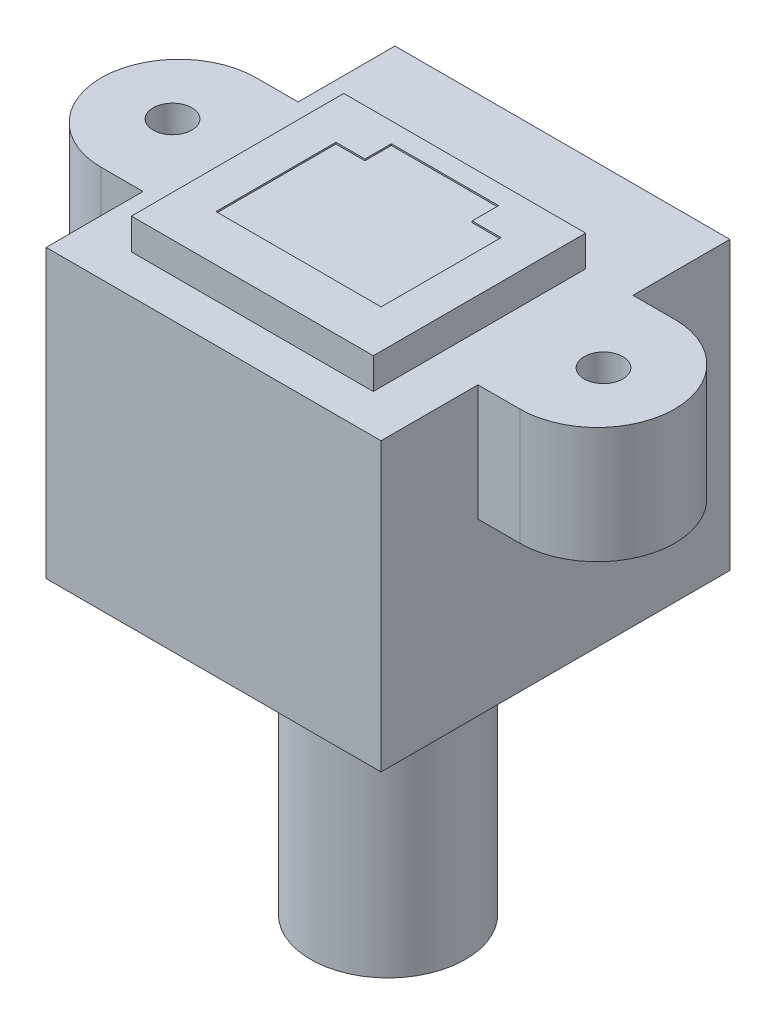
ISO-10303-21;
HEADER;
FILE_DESCRIPTION(('STEP AP214'),'2;1');
FILE_NAME('part.step','',(''),(''),'','','');
FILE_SCHEMA(('AUTOMOTIVE_DESIGN { 1 0 10303 214 1 1 1 1 }'));
ENDSEC;
DATA;
#1=APPLICATION_CONTEXT('core data for automotive mechanical design processes');
#2=APPLICATION_PROTOCOL_DEFINITION('international standard','automotive_design',2000,#1);
#3=PRODUCT_CONTEXT('',#1,'mechanical');
#4=PRODUCT('Part','Part','',(#3));
#5=PRODUCT_RELATED_PRODUCT_CATEGORY('part','',(#4));
#6=PRODUCT_DEFINITION_FORMATION('','',#4);
#7=PRODUCT_DEFINITION_CONTEXT('part definition',#1,'design');
#8=PRODUCT_DEFINITION('design','',#6,#7);
#9=PRODUCT_DEFINITION_SHAPE('','',#8);
#10=(LENGTH_UNIT() NAMED_UNIT(*) SI_UNIT(.MILLI.,.METRE.));
#11=(NAMED_UNIT(*) PLANE_ANGLE_UNIT() SI_UNIT($,.RADIAN.));
#12=(NAMED_UNIT(*) SI_UNIT($,.STERADIAN.) SOLID_ANGLE_UNIT());
#13=UNCERTAINTY_MEASURE_WITH_UNIT(LENGTH_MEASURE(1.E-05),#10,'distance_accuracy_value','');
#14=(GEOMETRIC_REPRESENTATION_CONTEXT(3) GLOBAL_UNCERTAINTY_ASSIGNED_CONTEXT((#13)) GLOBAL_UNIT_ASSIGNED_CONTEXT((#10,
#11,#12)) REPRESENTATION_CONTEXT('',''));
#15=CARTESIAN_POINT('',(0.,0.,0.));
#16=DIRECTION('',(0.,0.,1.));
#17=DIRECTION('',(1.,0.,0.));
#18=AXIS2_PLACEMENT_3D('',#15,#16,#17);
#19=CARTESIAN_POINT('',(-13.5,0.,-1.9));
#20=DIRECTION('',(0.,-1.,0.));
#21=DIRECTION('',(0.,0.,-1.));
#22=AXIS2_PLACEMENT_3D('',#19,#20,#21);
#23=PLANE('',#22);
#24=DIRECTION('',(0.,0.,-1.));
#25=VECTOR('',#24,1.);
#26=CARTESIAN_POINT('',(-10.8,0.,9.35));
#27=LINE('',#26,#25);
#28=CARTESIAN_POINT('',(-10.8,0.,9.35));
#29=VERTEX_POINT('',#28);
#30=CARTESIAN_POINT('',(-10.8,0.,3.1));
#31=VERTEX_POINT('',#30);
#32=EDGE_CURVE('E312',#29,#31,#27,.T.);
#33=ORIENTED_EDGE('',*,*,#32,.F.);
#34=DIRECTION('',(-1.,0.,0.));
#35=VECTOR('',#34,1.);
#36=CARTESIAN_POINT('',(-10.8,0.,9.35));
#37=LINE('',#36,#35);
#38=CARTESIAN_POINT('',(10.8,0.,9.35));
#39=VERTEX_POINT('',#38);
#40=EDGE_CURVE('E301',#39,#29,#37,.T.);
#41=ORIENTED_EDGE('',*,*,#40,.F.);
#42=DIRECTION('',(0.,0.,1.));
#43=VECTOR('',#42,1.);
#44=CARTESIAN_POINT('',(10.8,0.,9.35));
#45=LINE('',#44,#43);
#46=CARTESIAN_POINT('',(10.8,0.,3.1));
#47=VERTEX_POINT('',#46);
#48=EDGE_CURVE('E335',#47,#39,#45,.T.);
#49=ORIENTED_EDGE('',*,*,#48,.F.);
#50=DIRECTION('',(-1.,0.,0.));
#51=VECTOR('',#50,1.);
#52=CARTESIAN_POINT('',(13.5,0.,3.1));
#53=LINE('',#52,#51);
#54=CARTESIAN_POINT('',(13.5,0.,3.1));
#55=VERTEX_POINT('',#54);
#56=EDGE_CURVE('E333',#55,#47,#53,.T.);
#57=ORIENTED_EDGE('',*,*,#56,.F.);
#58=CARTESIAN_POINT('',(13.5,0.,-1.9));
#59=DIRECTION('',(0.,-1.,0.));
#60=DIRECTION('',(0.,0.,-1.));
#61=AXIS2_PLACEMENT_3D('',#58,#59,#60);
#62=CIRCLE('',#61,5.);
#63=CARTESIAN_POINT('',(13.5,0.,-6.9));
#64=VERTEX_POINT('',#63);
#65=EDGE_CURVE('E331',#64,#55,#62,.T.);
#66=ORIENTED_EDGE('',*,*,#65,.F.);
#67=DIRECTION('',(1.,0.,0.));
#68=VECTOR('',#67,1.);
#69=CARTESIAN_POINT('',(10.8,0.,-6.9));
#70=LINE('',#69,#68);
#71=CARTESIAN_POINT('',(10.8,0.,-6.9));
#72=VERTEX_POINT('',#71);
#73=EDGE_CURVE('E329',#72,#64,#70,.T.);
#74=ORIENTED_EDGE('',*,*,#73,.F.);
#75=DIRECTION('',(0.,0.,1.));
#76=VECTOR('',#75,1.);
#77=CARTESIAN_POINT('',(10.8,0.,-6.9));
#78=LINE('',#77,#76);
#79=CARTESIAN_POINT('',(10.8,0.,-13.15));
#80=VERTEX_POINT('',#79);
#81=EDGE_CURVE('E327',#80,#72,#78,.T.);
#82=ORIENTED_EDGE('',*,*,#81,.F.);
#83=DIRECTION('',(1.,0.,0.));
#84=VECTOR('',#83,1.);
#85=CARTESIAN_POINT('',(-10.8,0.,-13.15));
#86=LINE('',#85,#84);
#87=CARTESIAN_POINT('',(-10.8,0.,-13.15));
#88=VERTEX_POINT('',#87);
#89=EDGE_CURVE('E324',#88,#80,#86,.T.);
#90=ORIENTED_EDGE('',*,*,#89,.F.);
#91=DIRECTION('',(0.,0.,-1.));
#92=VECTOR('',#91,1.);
#93=CARTESIAN_POINT('',(-10.8,0.,-6.9));
#94=LINE('',#93,#92);
#95=CARTESIAN_POINT('',(-10.8,0.,-6.9));
#96=VERTEX_POINT('',#95);
#97=EDGE_CURVE('E321',#96,#88,#94,.T.);
#98=ORIENTED_EDGE('',*,*,#97,.F.);
#99=DIRECTION('',(1.,0.,0.));
#100=VECTOR('',#99,1.);
#101=CARTESIAN_POINT('',(-13.5,0.,-6.9));
#102=LINE('',#101,#100);
#103=CARTESIAN_POINT('',(-13.5,0.,-6.9));
#104=VERTEX_POINT('',#103);
#105=EDGE_CURVE('E319',#104,#96,#102,.T.);
#106=ORIENTED_EDGE('',*,*,#105,.F.);
#107=CARTESIAN_POINT('',(-13.5,0.,-1.9));
#108=DIRECTION('',(0.,-1.,0.));
#109=DIRECTION('',(0.,0.,-1.));
#110=AXIS2_PLACEMENT_3D('',#107,#108,#109);
#111=CIRCLE('',#110,5.);
#112=CARTESIAN_POINT('',(-13.5,0.,3.1));
#113=VERTEX_POINT('',#112);
#114=EDGE_CURVE('E317',#113,#104,#111,.T.);
#115=ORIENTED_EDGE('',*,*,#114,.F.);
#116=DIRECTION('',(-1.,0.,0.));
#117=VECTOR('',#116,1.);
#118=CARTESIAN_POINT('',(-13.5,0.,3.1));
#119=LINE('',#118,#117);
#120=EDGE_CURVE('E315',#31,#113,#119,.T.);
#121=ORIENTED_EDGE('',*,*,#120,.F.);
#122=EDGE_LOOP('',(#33,#41,#49,#57,#66,#74,#82,#90,#98,#106,#115,#121));
#123=FACE_BOUND('',#122,.T.);
#124=DIRECTION('',(1.,0.,0.));
#125=VECTOR('',#124,1.);
#126=CARTESIAN_POINT('',(7.8,0.,6.85));
#127=LINE('',#126,#125);
#128=CARTESIAN_POINT('',(-7.8,0.,6.85));
#129=VERTEX_POINT('',#128);
#130=CARTESIAN_POINT('',(7.8,0.,6.85));
#131=VERTEX_POINT('',#130);
#132=EDGE_CURVE('E385',#129,#131,#127,.T.);
#133=ORIENTED_EDGE('',*,*,#132,.F.);
#134=DIRECTION('',(0.,0.,1.));
#135=VECTOR('',#134,1.);
#136=CARTESIAN_POINT('',(-7.8,0.,6.85));
#137=LINE('',#136,#135);
#138=CARTESIAN_POINT('',(-7.8,0.,-6.85));
#139=VERTEX_POINT('',#138);
#140=EDGE_CURVE('E371',#139,#129,#137,.T.);
#141=ORIENTED_EDGE('',*,*,#140,.F.);
#142=DIRECTION('',(-1.,0.,0.));
#143=VECTOR('',#142,1.);
#144=CARTESIAN_POINT('',(7.8,0.,-6.85));
#145=LINE('',#144,#143);
#146=CARTESIAN_POINT('',(7.8,0.,-6.85));
#147=VERTEX_POINT('',#146);
#148=EDGE_CURVE('E376',#147,#139,#145,.T.);
#149=ORIENTED_EDGE('',*,*,#148,.F.);
#150=DIRECTION('',(0.,0.,-1.));
#151=VECTOR('',#150,1.);
#152=CARTESIAN_POINT('',(7.8,0.,6.85));
#153=LINE('',#152,#151);
#154=EDGE_CURVE('E388',#131,#147,#153,.T.);
#155=ORIENTED_EDGE('',*,*,#154,.F.);
#156=EDGE_LOOP('',(#133,#141,#149,#155));
#157=FACE_BOUND('',#156,.T.);
#158=CARTESIAN_POINT('',(-13.9,0.,-1.9));
#159=DIRECTION('',(0.,1.,0.));
#160=DIRECTION('',(0.,0.,1.));
#161=AXIS2_PLACEMENT_3D('',#158,#159,#160);
#162=CIRCLE('',#161,1.25);
#163=CARTESIAN_POINT('',(-13.9,0.,-0.650000000000003));
#164=VERTEX_POINT('',#163);
#165=EDGE_CURVE('E869',#164,#164,#162,.T.);
#166=ORIENTED_EDGE('',*,*,#165,.F.);
#167=EDGE_LOOP('',(#166));
#168=FACE_BOUND('',#167,.T.);
#169=CARTESIAN_POINT('',(13.9,0.,-1.9));
#170=DIRECTION('',(0.,1.,0.));
#171=DIRECTION('',(0.,0.,1.));
#172=AXIS2_PLACEMENT_3D('',#169,#170,#171);
#173=CIRCLE('',#172,1.25);
#174=CARTESIAN_POINT('',(13.9,0.,-0.650000000000003));
#175=VERTEX_POINT('',#174);
#176=EDGE_CURVE('E865',#175,#175,#173,.T.);
#177=ORIENTED_EDGE('',*,*,#176,.F.);
#178=EDGE_LOOP('',(#177));
#179=FACE_BOUND('',#178,.T.);
#180=ADVANCED_FACE('F36',(#123,#157,#168,#179),#23,.F.);
#181=CARTESIAN_POINT('',(-13.5,-7.5,-1.9));
#182=DIRECTION('',(0.,-1.,0.));
#183=DIRECTION('',(0.,0.,-1.));
#184=AXIS2_PLACEMENT_3D('',#181,#182,#183);
#185=PLANE('',#184);
#186=CARTESIAN_POINT('',(-13.9,-7.5,-1.9));
#187=DIRECTION('',(0.,-1.,0.));
#188=DIRECTION('',(0.,0.,-1.));
#189=AXIS2_PLACEMENT_3D('',#186,#187,#188);
#190=CIRCLE('',#189,1.25);
#191=CARTESIAN_POINT('',(-13.9,-7.5,-3.15));
#192=VERTEX_POINT('',#191);
#193=EDGE_CURVE('E237',#192,#192,#190,.T.);
#194=ORIENTED_EDGE('',*,*,#193,.F.);
#195=EDGE_LOOP('',(#194));
#196=FACE_BOUND('',#195,.T.);
#197=DIRECTION('',(0.,0.,-1.));
#198=VECTOR('',#197,1.);
#199=CARTESIAN_POINT('',(-10.8,-7.5,9.35));
#200=LINE('',#199,#198);
#201=CARTESIAN_POINT('',(-10.8,-7.5,3.1));
#202=VERTEX_POINT('',#201);
#203=CARTESIAN_POINT('',(-10.8,-7.5,-6.9));
#204=VERTEX_POINT('',#203);
#205=EDGE_CURVE('E290',#202,#204,#200,.T.);
#206=ORIENTED_EDGE('',*,*,#205,.F.);
#207=DIRECTION('',(-1.,0.,0.));
#208=VECTOR('',#207,1.);
#209=CARTESIAN_POINT('',(-13.5,-7.5,3.1));
#210=LINE('',#209,#208);
#211=CARTESIAN_POINT('',(-13.5,-7.5,3.1));
#212=VERTEX_POINT('',#211);
#213=EDGE_CURVE('E298',#202,#212,#210,.T.);
#214=ORIENTED_EDGE('',*,*,#213,.T.);
#215=CARTESIAN_POINT('',(-13.5,-7.5,-1.9));
#216=DIRECTION('',(0.,-1.,0.));
#217=DIRECTION('',(0.,0.,-1.));
#218=AXIS2_PLACEMENT_3D('',#215,#216,#217);
#219=CIRCLE('',#218,5.);
#220=CARTESIAN_POINT('',(-13.5,-7.5,-6.9));
#221=VERTEX_POINT('',#220);
#222=EDGE_CURVE('E300',#212,#221,#219,.T.);
#223=ORIENTED_EDGE('',*,*,#222,.T.);
#224=DIRECTION('',(1.,0.,0.));
#225=VECTOR('',#224,1.);
#226=CARTESIAN_POINT('',(-13.5,-7.5,-6.9));
#227=LINE('',#226,#225);
#228=EDGE_CURVE('E303',#221,#204,#227,.T.);
#229=ORIENTED_EDGE('',*,*,#228,.T.);
#230=EDGE_LOOP('',(#206,#214,#223,#229));
#231=FACE_BOUND('',#230,.T.);
#232=ADVANCED_FACE('F460',(#196,#231),#185,.T.);
#233=CARTESIAN_POINT('',(-7.8,2.,6.85));
#234=DIRECTION('',(1.,0.,0.));
#235=DIRECTION('',(0.,0.,-1.));
#236=AXIS2_PLACEMENT_3D('',#233,#234,#235);
#237=PLANE('',#236);
#238=ORIENTED_EDGE('',*,*,#140,.T.);
#239=DIRECTION('',(0.,-1.,0.));
#240=VECTOR('',#239,1.);
#241=CARTESIAN_POINT('',(-7.8,2.,6.85));
#242=LINE('',#241,#240);
#243=CARTESIAN_POINT('',(-7.8,2.,6.85));
#244=VERTEX_POINT('',#243);
#245=EDGE_CURVE('E297',#244,#129,#242,.T.);
#246=ORIENTED_EDGE('',*,*,#245,.F.);
#247=DIRECTION('',(0.,0.,1.));
#248=VECTOR('',#247,1.);
#249=CARTESIAN_POINT('',(-7.8,2.,6.85));
#250=LINE('',#249,#248);
#251=CARTESIAN_POINT('',(-7.8,2.,-6.85));
#252=VERTEX_POINT('',#251);
#253=EDGE_CURVE('E372',#252,#244,#250,.T.);
#254=ORIENTED_EDGE('',*,*,#253,.F.);
#255=DIRECTION('',(0.,-1.,0.));
#256=VECTOR('',#255,1.);
#257=CARTESIAN_POINT('',(-7.8,2.,-6.85));
#258=LINE('',#257,#256);
#259=EDGE_CURVE('E382',#252,#139,#258,.T.);
#260=ORIENTED_EDGE('',*,*,#259,.T.);
#261=EDGE_LOOP('',(#238,#246,#254,#260));
#262=FACE_BOUND('',#261,.T.);
#263=ADVANCED_FACE('F469',(#262),#237,.F.);
#264=CARTESIAN_POINT('',(7.8,2.,6.85));
#265=DIRECTION('',(0.,0.,-1.));
#266=DIRECTION('',(-1.,0.,0.));
#267=AXIS2_PLACEMENT_3D('',#264,#265,#266);
#268=PLANE('',#267);
#269=ORIENTED_EDGE('',*,*,#132,.T.);
#270=DIRECTION('',(0.,-1.,0.));
#271=VECTOR('',#270,1.);
#272=CARTESIAN_POINT('',(7.8,2.,6.85));
#273=LINE('',#272,#271);
#274=CARTESIAN_POINT('',(7.8,2.,6.85));
#275=VERTEX_POINT('',#274);
#276=EDGE_CURVE('E398',#275,#131,#273,.T.);
#277=ORIENTED_EDGE('',*,*,#276,.F.);
#278=DIRECTION('',(1.,0.,0.));
#279=VECTOR('',#278,1.);
#280=CARTESIAN_POINT('',(7.8,2.,6.85));
#281=LINE('',#280,#279);
#282=EDGE_CURVE('E375',#244,#275,#281,.T.);
#283=ORIENTED_EDGE('',*,*,#282,.F.);
#284=ORIENTED_EDGE('',*,*,#245,.T.);
#285=EDGE_LOOP('',(#269,#277,#283,#284));
#286=FACE_BOUND('',#285,.T.);
#287=ADVANCED_FACE('F519',(#286),#268,.F.);
#288=CARTESIAN_POINT('',(7.8,2.,6.85));
#289=DIRECTION('',(-1.,0.,0.));
#290=DIRECTION('',(0.,0.,1.));
#291=AXIS2_PLACEMENT_3D('',#288,#289,#290);
#292=PLANE('',#291);
#293=ORIENTED_EDGE('',*,*,#154,.T.);
#294=DIRECTION('',(0.,-1.,0.));
#295=VECTOR('',#294,1.);
#296=CARTESIAN_POINT('',(7.8,2.,-6.85));
#297=LINE('',#296,#295);
#298=CARTESIAN_POINT('',(7.8,2.,-6.85));
#299=VERTEX_POINT('',#298);
#300=EDGE_CURVE('E395',#299,#147,#297,.T.);
#301=ORIENTED_EDGE('',*,*,#300,.F.);
#302=DIRECTION('',(0.,0.,-1.));
#303=VECTOR('',#302,1.);
#304=CARTESIAN_POINT('',(7.8,2.,6.85));
#305=LINE('',#304,#303);
#306=EDGE_CURVE('E378',#275,#299,#305,.T.);
#307=ORIENTED_EDGE('',*,*,#306,.F.);
#308=ORIENTED_EDGE('',*,*,#276,.T.);
#309=EDGE_LOOP('',(#293,#301,#307,#308));
#310=FACE_BOUND('',#309,.T.);
#311=ADVANCED_FACE('F515',(#310),#292,.F.);
#312=CARTESIAN_POINT('',(7.8,2.,-6.85));
#313=DIRECTION('',(0.,0.,1.));
#314=DIRECTION('',(1.,0.,0.));
#315=AXIS2_PLACEMENT_3D('',#312,#313,#314);
#316=PLANE('',#315);
#317=ORIENTED_EDGE('',*,*,#148,.T.);
#318=ORIENTED_EDGE('',*,*,#259,.F.);
#319=DIRECTION('',(-1.,0.,0.));
#320=VECTOR('',#319,1.);
#321=CARTESIAN_POINT('',(7.8,2.,-6.85));
#322=LINE('',#321,#320);
#323=EDGE_CURVE('E380',#299,#252,#322,.T.);
#324=ORIENTED_EDGE('',*,*,#323,.F.);
#325=ORIENTED_EDGE('',*,*,#300,.T.);
#326=EDGE_LOOP('',(#317,#318,#324,#325));
#327=FACE_BOUND('',#326,.T.);
#328=ADVANCED_FACE('F511',(#327),#316,.F.);
#329=CARTESIAN_POINT('',(0.,2.,0.));
#330=DIRECTION('',(0.,1.,0.));
#331=DIRECTION('',(0.,0.,1.));
#332=AXIS2_PLACEMENT_3D('',#329,#330,#331);
#333=PLANE('',#332);
#334=DIRECTION('',(-1.,0.,0.));
#335=VECTOR('',#334,1.);
#336=CARTESIAN_POINT('',(-3.45868570875021,2.,-3.86958379540227));
#337=LINE('',#336,#335);
#338=CARTESIAN_POINT('',(-3.45868570875021,2.,-3.86958379540227));
#339=VERTEX_POINT('',#338);
#340=CARTESIAN_POINT('',(-5.32674456624502,2.,-3.86958379540227));
#341=VERTEX_POINT('',#340);
#342=EDGE_CURVE('E53',#339,#341,#337,.T.);
#343=ORIENTED_EDGE('',*,*,#342,.F.);
#344=DIRECTION('',(0.,0.,1.));
#345=VECTOR('',#344,1.);
#346=CARTESIAN_POINT('',(-3.45868570875021,2.,-3.86958379540227));
#347=LINE('',#346,#345);
#348=CARTESIAN_POINT('',(-3.45868570875021,2.,-5.57520275224535));
#349=VERTEX_POINT('',#348);
#350=EDGE_CURVE('E231',#349,#339,#347,.T.);
#351=ORIENTED_EDGE('',*,*,#350,.F.);
#352=DIRECTION('',(-1.,0.,0.));
#353=VECTOR('',#352,1.);
#354=CARTESIAN_POINT('',(-3.45868570875021,2.,-5.57520275224535));
#355=LINE('',#354,#353);
#356=CARTESIAN_POINT('',(3.45868570875021,2.,-5.57520275224535));
#357=VERTEX_POINT('',#356);
#358=EDGE_CURVE('E234',#357,#349,#355,.T.);
#359=ORIENTED_EDGE('',*,*,#358,.F.);
#360=DIRECTION('',(0.,0.,-1.));
#361=VECTOR('',#360,1.);
#362=CARTESIAN_POINT('',(3.45868570875021,2.,-3.86958379540227));
#363=LINE('',#362,#361);
#364=CARTESIAN_POINT('',(3.45868570875021,2.,-3.86958379540227));
#365=VERTEX_POINT('',#364);
#366=EDGE_CURVE('E265',#365,#357,#363,.T.);
#367=ORIENTED_EDGE('',*,*,#366,.F.);
#368=DIRECTION('',(-1.,0.,0.));
#369=VECTOR('',#368,1.);
#370=CARTESIAN_POINT('',(5.32674456624502,2.,-3.86958379540227));
#371=LINE('',#370,#369);
#372=CARTESIAN_POINT('',(5.32674456624502,2.,-3.86958379540227));
#373=VERTEX_POINT('',#372);
#374=EDGE_CURVE('E262',#373,#365,#371,.T.);
#375=ORIENTED_EDGE('',*,*,#374,.F.);
#376=DIRECTION('',(0.,0.,-1.));
#377=VECTOR('',#376,1.);
#378=CARTESIAN_POINT('',(5.32674456624502,2.,3.86958379540227));
#379=LINE('',#378,#377);
#380=CARTESIAN_POINT('',(5.32674456624502,2.,3.86958379540227));
#381=VERTEX_POINT('',#380);
#382=EDGE_CURVE('E259',#381,#373,#379,.T.);
#383=ORIENTED_EDGE('',*,*,#382,.F.);
#384=DIRECTION('',(1.,0.,0.));
#385=VECTOR('',#384,1.);
#386=CARTESIAN_POINT('',(5.32674456624502,2.,3.86958379540227));
#387=LINE('',#386,#385);
#388=CARTESIAN_POINT('',(-5.32674456624502,2.,3.86958379540227));
#389=VERTEX_POINT('',#388);
#390=EDGE_CURVE('E256',#389,#381,#387,.T.);
#391=ORIENTED_EDGE('',*,*,#390,.F.);
#392=DIRECTION('',(0.,0.,1.));
#393=VECTOR('',#392,1.);
#394=CARTESIAN_POINT('',(-5.32674456624502,2.,3.86958379540227));
#395=LINE('',#394,#393);
#396=EDGE_CURVE('E254',#341,#389,#395,.T.);
#397=ORIENTED_EDGE('',*,*,#396,.F.);
#398=EDGE_LOOP('',(#343,#351,#359,#367,#375,#383,#391,#397));
#399=FACE_BOUND('',#398,.T.);
#400=ORIENTED_EDGE('',*,*,#253,.T.);
#401=ORIENTED_EDGE('',*,*,#282,.T.);
#402=ORIENTED_EDGE('',*,*,#306,.T.);
#403=ORIENTED_EDGE('',*,*,#323,.T.);
#404=EDGE_LOOP('',(#400,#401,#402,#403));
#405=FACE_BOUND('',#404,.T.);
#406=ADVANCED_FACE('F508',(#399,#405),#333,.T.);
#407=CARTESIAN_POINT('',(-10.8,-7.5,9.35));
#408=DIRECTION('',(1.,0.,0.));
#409=DIRECTION('',(0.,0.,-1.));
#410=AXIS2_PLACEMENT_3D('',#407,#408,#409);
#411=PLANE('',#410);
#412=DIRECTION('',(0.,1.,0.));
#413=VECTOR('',#412,1.);
#414=CARTESIAN_POINT('',(-10.8,-7.5,-13.15));
#415=LINE('',#414,#413);
#416=CARTESIAN_POINT('',(-10.8,-18.5,-13.15));
#417=VERTEX_POINT('',#416);
#418=EDGE_CURVE('E357',#417,#88,#415,.T.);
#419=ORIENTED_EDGE('',*,*,#418,.F.);
#420=DIRECTION('',(0.,0.,1.));
#421=VECTOR('',#420,1.);
#422=CARTESIAN_POINT('',(-10.8,-18.5,9.35));
#423=LINE('',#422,#421);
#424=CARTESIAN_POINT('',(-10.8,-18.5,9.35));
#425=VERTEX_POINT('',#424);
#426=EDGE_CURVE('E11',#417,#425,#423,.T.);
#427=ORIENTED_EDGE('',*,*,#426,.T.);
#428=DIRECTION('',(0.,1.,0.));
#429=VECTOR('',#428,1.);
#430=CARTESIAN_POINT('',(-10.8,-7.5,9.35));
#431=LINE('',#430,#429);
#432=EDGE_CURVE('E311',#425,#29,#431,.T.);
#433=ORIENTED_EDGE('',*,*,#432,.T.);
#434=ORIENTED_EDGE('',*,*,#32,.T.);
#435=DIRECTION('',(0.,1.,0.));
#436=VECTOR('',#435,1.);
#437=CARTESIAN_POINT('',(-10.8,-7.5,3.1));
#438=LINE('',#437,#436);
#439=EDGE_CURVE('E368',#202,#31,#438,.T.);
#440=ORIENTED_EDGE('',*,*,#439,.F.);
#441=ORIENTED_EDGE('',*,*,#205,.T.);
#442=DIRECTION('',(0.,1.,0.));
#443=VECTOR('',#442,1.);
#444=CARTESIAN_POINT('',(-10.8,-7.5,-6.9));
#445=LINE('',#444,#443);
#446=EDGE_CURVE('E359',#204,#96,#445,.T.);
#447=ORIENTED_EDGE('',*,*,#446,.T.);
#448=ORIENTED_EDGE('',*,*,#97,.T.);
#449=EDGE_LOOP('',(#419,#427,#433,#434,#440,#441,#447,#448));
#450=FACE_BOUND('',#449,.T.);
#451=ADVANCED_FACE('F438',(#450),#411,.F.);
#452=CARTESIAN_POINT('',(-13.5,-7.5,3.1));
#453=DIRECTION('',(0.,0.,-1.));
#454=DIRECTION('',(-1.,0.,0.));
#455=AXIS2_PLACEMENT_3D('',#452,#453,#454);
#456=PLANE('',#455);
#457=ORIENTED_EDGE('',*,*,#120,.T.);
#458=DIRECTION('',(0.,1.,0.));
#459=VECTOR('',#458,1.);
#460=CARTESIAN_POINT('',(-13.5,-7.5,3.1));
#461=LINE('',#460,#459);
#462=EDGE_CURVE('E365',#212,#113,#461,.T.);
#463=ORIENTED_EDGE('',*,*,#462,.F.);
#464=ORIENTED_EDGE('',*,*,#213,.F.);
#465=ORIENTED_EDGE('',*,*,#439,.T.);
#466=EDGE_LOOP('',(#457,#463,#464,#465));
#467=FACE_BOUND('',#466,.T.);
#468=ADVANCED_FACE('F501',(#467),#456,.F.);
#469=CARTESIAN_POINT('',(-13.5,-7.5,-1.9));
#470=DIRECTION('',(0.,1.,0.));
#471=DIRECTION('',(0.,0.,1.));
#472=AXIS2_PLACEMENT_3D('',#469,#470,#471);
#473=CYLINDRICAL_SURFACE('',#472,5.);
#474=ORIENTED_EDGE('',*,*,#114,.T.);
#475=DIRECTION('',(0.,1.,0.));
#476=VECTOR('',#475,1.);
#477=CARTESIAN_POINT('',(-13.5,-7.5,-6.9));
#478=LINE('',#477,#476);
#479=EDGE_CURVE('E362',#221,#104,#478,.T.);
#480=ORIENTED_EDGE('',*,*,#479,.F.);
#481=ORIENTED_EDGE('',*,*,#222,.F.);
#482=ORIENTED_EDGE('',*,*,#462,.T.);
#483=EDGE_LOOP('',(#474,#480,#481,#482));
#484=FACE_BOUND('',#483,.T.);
#485=ADVANCED_FACE('F497',(#484),#473,.T.);
#486=CARTESIAN_POINT('',(-13.5,-7.5,-6.9));
#487=DIRECTION('',(0.,0.,1.));
#488=DIRECTION('',(1.,0.,0.));
#489=AXIS2_PLACEMENT_3D('',#486,#487,#488);
#490=PLANE('',#489);
#491=ORIENTED_EDGE('',*,*,#105,.T.);
#492=ORIENTED_EDGE('',*,*,#446,.F.);
#493=ORIENTED_EDGE('',*,*,#228,.F.);
#494=ORIENTED_EDGE('',*,*,#479,.T.);
#495=EDGE_LOOP('',(#491,#492,#493,#494));
#496=FACE_BOUND('',#495,.T.);
#497=ADVANCED_FACE('F494',(#496),#490,.F.);
#498=CARTESIAN_POINT('',(-10.8,-7.5,-13.15));
#499=DIRECTION('',(0.,0.,1.));
#500=DIRECTION('',(1.,0.,0.));
#501=AXIS2_PLACEMENT_3D('',#498,#499,#500);
#502=PLANE('',#501);
#503=DIRECTION('',(0.,1.,0.));
#504=VECTOR('',#503,1.);
#505=CARTESIAN_POINT('',(10.8,-7.5,-13.15));
#506=LINE('',#505,#504);
#507=CARTESIAN_POINT('',(10.8,-18.5,-13.15));
#508=VERTEX_POINT('',#507);
#509=EDGE_CURVE('E355',#508,#80,#506,.T.);
#510=ORIENTED_EDGE('',*,*,#509,.F.);
#511=DIRECTION('',(-1.,0.,0.));
#512=VECTOR('',#511,1.);
#513=CARTESIAN_POINT('',(-10.8,-18.5,-13.15));
#514=LINE('',#513,#512);
#515=EDGE_CURVE('E45',#508,#417,#514,.T.);
#516=ORIENTED_EDGE('',*,*,#515,.T.);
#517=ORIENTED_EDGE('',*,*,#418,.T.);
#518=ORIENTED_EDGE('',*,*,#89,.T.);
#519=EDGE_LOOP('',(#510,#516,#517,#518));
#520=FACE_BOUND('',#519,.T.);
#521=ADVANCED_FACE('F490',(#520),#502,.F.);
#522=CARTESIAN_POINT('',(10.8,-7.5,-6.9));
#523=DIRECTION('',(-1.,0.,0.));
#524=DIRECTION('',(0.,0.,1.));
#525=AXIS2_PLACEMENT_3D('',#522,#523,#524);
#526=PLANE('',#525);
#527=DIRECTION('',(0.,1.,0.));
#528=VECTOR('',#527,1.);
#529=CARTESIAN_POINT('',(10.8,-7.5,9.35));
#530=LINE('',#529,#528);
#531=CARTESIAN_POINT('',(10.8,-18.5,9.35));
#532=VERTEX_POINT('',#531);
#533=EDGE_CURVE('E341',#532,#39,#530,.T.);
#534=ORIENTED_EDGE('',*,*,#533,.F.);
#535=DIRECTION('',(0.,0.,-1.));
#536=VECTOR('',#535,1.);
#537=CARTESIAN_POINT('',(10.8,-18.5,-13.15));
#538=LINE('',#537,#536);
#539=EDGE_CURVE('E414',#532,#508,#538,.T.);
#540=ORIENTED_EDGE('',*,*,#539,.T.);
#541=ORIENTED_EDGE('',*,*,#509,.T.);
#542=ORIENTED_EDGE('',*,*,#81,.T.);
#543=DIRECTION('',(0.,1.,0.));
#544=VECTOR('',#543,1.);
#545=CARTESIAN_POINT('',(10.8,-7.5,-6.9));
#546=LINE('',#545,#544);
#547=CARTESIAN_POINT('',(10.8,-7.5,-6.9));
#548=VERTEX_POINT('',#547);
#549=EDGE_CURVE('E352',#548,#72,#546,.T.);
#550=ORIENTED_EDGE('',*,*,#549,.F.);
#551=DIRECTION('',(0.,0.,1.));
#552=VECTOR('',#551,1.);
#553=CARTESIAN_POINT('',(10.8,-7.5,9.35));
#554=LINE('',#553,#552);
#555=CARTESIAN_POINT('',(10.8,-7.5,3.1));
#556=VERTEX_POINT('',#555);
#557=EDGE_CURVE('E294',#548,#556,#554,.T.);
#558=ORIENTED_EDGE('',*,*,#557,.T.);
#559=DIRECTION('',(0.,1.,0.));
#560=VECTOR('',#559,1.);
#561=CARTESIAN_POINT('',(10.8,-7.5,3.1));
#562=LINE('',#561,#560);
#563=EDGE_CURVE('E343',#556,#47,#562,.T.);
#564=ORIENTED_EDGE('',*,*,#563,.T.);
#565=ORIENTED_EDGE('',*,*,#48,.T.);
#566=EDGE_LOOP('',(#534,#540,#541,#542,#550,#558,#564,#565));
#567=FACE_BOUND('',#566,.T.);
#568=ADVANCED_FACE('F486',(#567),#526,.F.);
#569=CARTESIAN_POINT('',(10.8,-7.5,-6.9));
#570=DIRECTION('',(0.,0.,1.));
#571=DIRECTION('',(1.,0.,0.));
#572=AXIS2_PLACEMENT_3D('',#569,#570,#571);
#573=PLANE('',#572);
#574=ORIENTED_EDGE('',*,*,#73,.T.);
#575=DIRECTION('',(0.,1.,0.));
#576=VECTOR('',#575,1.);
#577=CARTESIAN_POINT('',(13.5,-7.5,-6.9));
#578=LINE('',#577,#576);
#579=CARTESIAN_POINT('',(13.5,-7.5,-6.9));
#580=VERTEX_POINT('',#579);
#581=EDGE_CURVE('E349',#580,#64,#578,.T.);
#582=ORIENTED_EDGE('',*,*,#581,.F.);
#583=DIRECTION('',(1.,0.,0.));
#584=VECTOR('',#583,1.);
#585=CARTESIAN_POINT('',(10.8,-7.5,-6.9));
#586=LINE('',#585,#584);
#587=EDGE_CURVE('E305',#548,#580,#586,.T.);
#588=ORIENTED_EDGE('',*,*,#587,.F.);
#589=ORIENTED_EDGE('',*,*,#549,.T.);
#590=EDGE_LOOP('',(#574,#582,#588,#589));
#591=FACE_BOUND('',#590,.T.);
#592=ADVANCED_FACE('F482',(#591),#573,.F.);
#593=CARTESIAN_POINT('',(13.5,-7.5,-1.9));
#594=DIRECTION('',(0.,1.,0.));
#595=DIRECTION('',(0.,0.,1.));
#596=AXIS2_PLACEMENT_3D('',#593,#594,#595);
#597=CYLINDRICAL_SURFACE('',#596,5.);
#598=ORIENTED_EDGE('',*,*,#65,.T.);
#599=DIRECTION('',(0.,1.,0.));
#600=VECTOR('',#599,1.);
#601=CARTESIAN_POINT('',(13.5,-7.5,3.1));
#602=LINE('',#601,#600);
#603=CARTESIAN_POINT('',(13.5,-7.5,3.1));
#604=VERTEX_POINT('',#603);
#605=EDGE_CURVE('E346',#604,#55,#602,.T.);
#606=ORIENTED_EDGE('',*,*,#605,.F.);
#607=CARTESIAN_POINT('',(13.5,-7.5,-1.9));
#608=DIRECTION('',(0.,-1.,0.));
#609=DIRECTION('',(0.,0.,-1.));
#610=AXIS2_PLACEMENT_3D('',#607,#608,#609);
#611=CIRCLE('',#610,5.);
#612=EDGE_CURVE('E307',#580,#604,#611,.T.);
#613=ORIENTED_EDGE('',*,*,#612,.F.);
#614=ORIENTED_EDGE('',*,*,#581,.T.);
#615=EDGE_LOOP('',(#598,#606,#613,#614));
#616=FACE_BOUND('',#615,.T.);
#617=ADVANCED_FACE('F478',(#616),#597,.T.);
#618=CARTESIAN_POINT('',(13.5,-7.5,3.1));
#619=DIRECTION('',(0.,0.,-1.));
#620=DIRECTION('',(-1.,0.,0.));
#621=AXIS2_PLACEMENT_3D('',#618,#619,#620);
#622=PLANE('',#621);
#623=ORIENTED_EDGE('',*,*,#56,.T.);
#624=ORIENTED_EDGE('',*,*,#563,.F.);
#625=DIRECTION('',(-1.,0.,0.));
#626=VECTOR('',#625,1.);
#627=CARTESIAN_POINT('',(13.5,-7.5,3.1));
#628=LINE('',#627,#626);
#629=EDGE_CURVE('E309',#604,#556,#628,.T.);
#630=ORIENTED_EDGE('',*,*,#629,.F.);
#631=ORIENTED_EDGE('',*,*,#605,.T.);
#632=EDGE_LOOP('',(#623,#624,#630,#631));
#633=FACE_BOUND('',#632,.T.);
#634=ADVANCED_FACE('F475',(#633),#622,.F.);
#635=CARTESIAN_POINT('',(-10.8,-7.5,9.35));
#636=DIRECTION('',(0.,0.,-1.));
#637=DIRECTION('',(-1.,0.,0.));
#638=AXIS2_PLACEMENT_3D('',#635,#636,#637);
#639=PLANE('',#638);
#640=ORIENTED_EDGE('',*,*,#432,.F.);
#641=DIRECTION('',(1.,0.,0.));
#642=VECTOR('',#641,1.);
#643=CARTESIAN_POINT('',(10.8,-18.5,9.35));
#644=LINE('',#643,#642);
#645=EDGE_CURVE('E411',#425,#532,#644,.T.);
#646=ORIENTED_EDGE('',*,*,#645,.T.);
#647=ORIENTED_EDGE('',*,*,#533,.T.);
#648=ORIENTED_EDGE('',*,*,#40,.T.);
#649=EDGE_LOOP('',(#640,#646,#647,#648));
#650=FACE_BOUND('',#649,.T.);
#651=ADVANCED_FACE('F441',(#650),#639,.F.);
#652=CARTESIAN_POINT('',(13.9,-7.5,-1.9));
#653=DIRECTION('',(0.,-1.,0.));
#654=DIRECTION('',(0.,0.,-1.));
#655=AXIS2_PLACEMENT_3D('',#652,#653,#654);
#656=CIRCLE('',#655,1.25);
#657=CARTESIAN_POINT('',(13.9,-7.5,-3.15));
#658=VERTEX_POINT('',#657);
#659=EDGE_CURVE('E868',#658,#658,#656,.T.);
#660=ORIENTED_EDGE('',*,*,#659,.F.);
#661=EDGE_LOOP('',(#660));
#662=FACE_BOUND('',#661,.T.);
#663=ORIENTED_EDGE('',*,*,#557,.F.);
#664=ORIENTED_EDGE('',*,*,#587,.T.);
#665=ORIENTED_EDGE('',*,*,#612,.T.);
#666=ORIENTED_EDGE('',*,*,#629,.T.);
#667=EDGE_LOOP('',(#663,#664,#665,#666));
#668=FACE_BOUND('',#667,.T.);
#669=ADVANCED_FACE('F451',(#662,#668),#185,.T.);
#670=CARTESIAN_POINT('',(0.,-22.5,0.));
#671=DIRECTION('',(0.,-1.,0.));
#672=DIRECTION('',(0.,0.,-1.));
#673=AXIS2_PLACEMENT_3D('',#670,#671,#672);
#674=PLANE('',#673);
#675=CARTESIAN_POINT('',(0.,-22.5,-1.9));
#676=DIRECTION('',(0.,-1.,0.));
#677=DIRECTION('',(0.,0.,-1.));
#678=AXIS2_PLACEMENT_3D('',#675,#676,#677);
#679=CIRCLE('',#678,5.);
#680=CARTESIAN_POINT('',(0.,-22.5,-6.9));
#681=VERTEX_POINT('',#680);
#682=EDGE_CURVE('E272',#681,#681,#679,.T.);
#683=ORIENTED_EDGE('',*,*,#682,.F.);
#684=EDGE_LOOP('',(#683));
#685=FACE_BOUND('',#684,.T.);
#686=DIRECTION('',(0.,0.,1.));
#687=VECTOR('',#686,1.);
#688=CARTESIAN_POINT('',(6.79999999999999,-22.5,9.35));
#689=LINE('',#688,#687);
#690=CARTESIAN_POINT('',(6.79999999999999,-22.5,-9.14999999999999));
#691=VERTEX_POINT('',#690);
#692=CARTESIAN_POINT('',(6.79999999999999,-22.5,5.34999999999999));
#693=VERTEX_POINT('',#692);
#694=EDGE_CURVE('E406',#691,#693,#689,.T.);
#695=ORIENTED_EDGE('',*,*,#694,.T.);
#696=DIRECTION('',(-1.,0.,0.));
#697=VECTOR('',#696,1.);
#698=CARTESIAN_POINT('',(-10.8,-22.5,5.34999999999999));
#699=LINE('',#698,#697);
#700=CARTESIAN_POINT('',(-6.79999999999999,-22.5,5.34999999999999));
#701=VERTEX_POINT('',#700);
#702=EDGE_CURVE('E408',#693,#701,#699,.T.);
#703=ORIENTED_EDGE('',*,*,#702,.T.);
#704=DIRECTION('',(0.,0.,-1.));
#705=VECTOR('',#704,1.);
#706=CARTESIAN_POINT('',(-6.80000000000001,-22.5,-13.15));
#707=LINE('',#706,#705);
#708=CARTESIAN_POINT('',(-6.80000000000001,-22.5,-9.14999999999999));
#709=VERTEX_POINT('',#708);
#710=EDGE_CURVE('E293',#701,#709,#707,.T.);
#711=ORIENTED_EDGE('',*,*,#710,.T.);
#712=DIRECTION('',(1.,0.,0.));
#713=VECTOR('',#712,1.);
#714=CARTESIAN_POINT('',(10.8,-22.5,-9.14999999999999));
#715=LINE('',#714,#713);
#716=EDGE_CURVE('E404',#709,#691,#715,.T.);
#717=ORIENTED_EDGE('',*,*,#716,.T.);
#718=EDGE_LOOP('',(#695,#703,#711,#717));
#719=FACE_BOUND('',#718,.T.);
#720=ADVANCED_FACE('F449',(#685,#719),#674,.T.);
#721=CARTESIAN_POINT('',(0.,-22.5,-9.14999999999999));
#722=DIRECTION('',(0.,-0.707106781186546,-0.707106781186549));
#723=DIRECTION('',(-1.,0.,0.));
#724=AXIS2_PLACEMENT_3D('',#721,#722,#723);
#725=PLANE('',#724);
#726=DIRECTION('',(0.577350269189625,-0.577350269189628,0.577350269189625));
#727=VECTOR('',#726,1.);
#728=CARTESIAN_POINT('',(-3.75000000000001,-25.55,-6.1));
#729=LINE('',#728,#727);
#730=EDGE_CURVE('E419',#417,#709,#729,.T.);
#731=ORIENTED_EDGE('',*,*,#730,.F.);
#732=ORIENTED_EDGE('',*,*,#515,.F.);
#733=DIRECTION('',(-0.577350269189625,-0.577350269189628,0.577350269189625));
#734=VECTOR('',#733,1.);
#735=CARTESIAN_POINT('',(4.53333333333333,-24.7666666666667,-6.88333333333334));
#736=LINE('',#735,#734);
#737=EDGE_CURVE('E40',#691,#508,#736,.F.);
#738=ORIENTED_EDGE('',*,*,#737,.F.);
#739=ORIENTED_EDGE('',*,*,#716,.F.);
#740=EDGE_LOOP('',(#731,#732,#738,#739));
#741=FACE_BOUND('',#740,.T.);
#742=ADVANCED_FACE('F38',(#741),#725,.T.);
#743=CARTESIAN_POINT('',(6.79999999999999,-22.5,0.));
#744=DIRECTION('',(0.707106781186549,-0.707106781186546,0.));
#745=DIRECTION('',(0.,0.,-1.));
#746=AXIS2_PLACEMENT_3D('',#743,#744,#745);
#747=PLANE('',#746);
#748=ORIENTED_EDGE('',*,*,#737,.T.);
#749=ORIENTED_EDGE('',*,*,#539,.F.);
#750=DIRECTION('',(-0.577350269189625,-0.577350269189628,-0.577350269189625));
#751=VECTOR('',#750,1.);
#752=CARTESIAN_POINT('',(5.01666666666667,-24.2833333333333,3.56666666666667));
#753=LINE('',#752,#751);
#754=EDGE_CURVE('E418',#693,#532,#753,.F.);
#755=ORIENTED_EDGE('',*,*,#754,.F.);
#756=ORIENTED_EDGE('',*,*,#694,.F.);
#757=EDGE_LOOP('',(#748,#749,#755,#756));
#758=FACE_BOUND('',#757,.T.);
#759=ADVANCED_FACE('F430',(#758),#747,.T.);
#760=CARTESIAN_POINT('',(-6.8,-22.5,0.));
#761=DIRECTION('',(-0.707106781186549,-0.707106781186546,0.));
#762=DIRECTION('',(0.,0.,1.));
#763=AXIS2_PLACEMENT_3D('',#760,#761,#762);
#764=PLANE('',#763);
#765=ORIENTED_EDGE('',*,*,#730,.T.);
#766=ORIENTED_EDGE('',*,*,#710,.F.);
#767=DIRECTION('',(-0.577350269189625,0.577350269189628,0.577350269189625));
#768=VECTOR('',#767,1.);
#769=CARTESIAN_POINT('',(-5.01666666666667,-24.2833333333333,3.56666666666667));
#770=LINE('',#769,#768);
#771=EDGE_CURVE('E287',#425,#701,#770,.F.);
#772=ORIENTED_EDGE('',*,*,#771,.F.);
#773=ORIENTED_EDGE('',*,*,#426,.F.);
#774=EDGE_LOOP('',(#765,#766,#772,#773));
#775=FACE_BOUND('',#774,.T.);
#776=ADVANCED_FACE('F435',(#775),#764,.T.);
#777=CARTESIAN_POINT('',(0.,-22.5,5.34999999999999));
#778=DIRECTION('',(0.,-0.707106781186545,0.70710678118655));
#779=DIRECTION('',(1.,0.,0.));
#780=AXIS2_PLACEMENT_3D('',#777,#778,#779);
#781=PLANE('',#780);
#782=ORIENTED_EDGE('',*,*,#754,.T.);
#783=ORIENTED_EDGE('',*,*,#645,.F.);
#784=ORIENTED_EDGE('',*,*,#771,.T.);
#785=ORIENTED_EDGE('',*,*,#702,.F.);
#786=EDGE_LOOP('',(#782,#783,#784,#785));
#787=FACE_BOUND('',#786,.T.);
#788=ADVANCED_FACE('F446',(#787),#781,.T.);
#789=CARTESIAN_POINT('',(0.,-37.5,-1.9));
#790=DIRECTION('',(0.,1.,0.));
#791=DIRECTION('',(0.,0.,1.));
#792=AXIS2_PLACEMENT_3D('',#789,#790,#791);
#793=CYLINDRICAL_SURFACE('',#792,5.);
#794=CARTESIAN_POINT('',(0.,-37.5,-1.9));
#795=DIRECTION('',(0.,-1.,0.));
#796=DIRECTION('',(0.,0.,-1.));
#797=AXIS2_PLACEMENT_3D('',#794,#795,#796);
#798=CIRCLE('',#797,5.);
#799=CARTESIAN_POINT('',(0.,-37.5,-6.9));
#800=VERTEX_POINT('',#799);
#801=EDGE_CURVE('E284',#800,#800,#798,.T.);
#802=ORIENTED_EDGE('',*,*,#801,.F.);
#803=EDGE_LOOP('',(#802));
#804=FACE_BOUND('',#803,.T.);
#805=ORIENTED_EDGE('',*,*,#682,.T.);
#806=EDGE_LOOP('',(#805));
#807=FACE_BOUND('',#806,.T.);
#808=ADVANCED_FACE('F529',(#804,#807),#793,.T.);
#809=CARTESIAN_POINT('',(0.,-37.5,-1.9));
#810=DIRECTION('',(0.,-1.,0.));
#811=DIRECTION('',(0.,0.,-1.));
#812=AXIS2_PLACEMENT_3D('',#809,#810,#811);
#813=PLANE('',#812);
#814=ORIENTED_EDGE('',*,*,#801,.T.);
#815=EDGE_LOOP('',(#814));
#816=FACE_BOUND('',#815,.T.);
#817=ADVANCED_FACE('F552',(#816),#813,.T.);
#818=CARTESIAN_POINT('',(-3.45868570875021,1.9,-3.86958379540227));
#819=DIRECTION('',(0.,0.,-1.));
#820=DIRECTION('',(-1.,0.,0.));
#821=AXIS2_PLACEMENT_3D('',#818,#819,#820);
#822=PLANE('',#821);
#823=ORIENTED_EDGE('',*,*,#342,.T.);
#824=DIRECTION('',(0.,1.,0.));
#825=VECTOR('',#824,1.);
#826=CARTESIAN_POINT('',(-5.32674456624502,1.9,-3.86958379540227));
#827=LINE('',#826,#825);
#828=CARTESIAN_POINT('',(-5.32674456624502,1.9,-3.86958379540227));
#829=VERTEX_POINT('',#828);
#830=EDGE_CURVE('E208',#829,#341,#827,.T.);
#831=ORIENTED_EDGE('',*,*,#830,.F.);
#832=DIRECTION('',(-1.,0.,0.));
#833=VECTOR('',#832,1.);
#834=CARTESIAN_POINT('',(-3.45868570875021,1.9,-3.86958379540227));
#835=LINE('',#834,#833);
#836=CARTESIAN_POINT('',(-3.45868570875021,1.9,-3.86958379540227));
#837=VERTEX_POINT('',#836);
#838=EDGE_CURVE('E212',#837,#829,#835,.T.);
#839=ORIENTED_EDGE('',*,*,#838,.F.);
#840=DIRECTION('',(0.,1.,0.));
#841=VECTOR('',#840,1.);
#842=CARTESIAN_POINT('',(-3.45868570875021,1.9,-3.86958379540227));
#843=LINE('',#842,#841);
#844=EDGE_CURVE('E270',#837,#339,#843,.T.);
#845=ORIENTED_EDGE('',*,*,#844,.T.);
#846=EDGE_LOOP('',(#823,#831,#839,#845));
#847=FACE_BOUND('',#846,.T.);
#848=ADVANCED_FACE('F210',(#847),#822,.F.);
#849=CARTESIAN_POINT('',(-3.45868570875021,1.9,-3.86958379540227));
#850=DIRECTION('',(-1.,0.,0.));
#851=DIRECTION('',(0.,0.,1.));
#852=AXIS2_PLACEMENT_3D('',#849,#850,#851);
#853=PLANE('',#852);
#854=ORIENTED_EDGE('',*,*,#350,.T.);
#855=ORIENTED_EDGE('',*,*,#844,.F.);
#856=DIRECTION('',(0.,0.,1.));
#857=VECTOR('',#856,1.);
#858=CARTESIAN_POINT('',(-3.45868570875021,1.9,-3.86958379540227));
#859=LINE('',#858,#857);
#860=CARTESIAN_POINT('',(-3.45868570875021,1.9,-5.57520275224535));
#861=VERTEX_POINT('',#860);
#862=EDGE_CURVE('E218',#861,#837,#859,.T.);
#863=ORIENTED_EDGE('',*,*,#862,.F.);
#864=DIRECTION('',(0.,1.,0.));
#865=VECTOR('',#864,1.);
#866=CARTESIAN_POINT('',(-3.45868570875021,1.9,-5.57520275224535));
#867=LINE('',#866,#865);
#868=EDGE_CURVE('E273',#861,#349,#867,.T.);
#869=ORIENTED_EDGE('',*,*,#868,.T.);
#870=EDGE_LOOP('',(#854,#855,#863,#869));
#871=FACE_BOUND('',#870,.T.);
#872=ADVANCED_FACE('F568',(#871),#853,.F.);
#873=CARTESIAN_POINT('',(-3.45868570875021,1.9,-5.57520275224535));
#874=DIRECTION('',(0.,0.,-1.));
#875=DIRECTION('',(-1.,0.,0.));
#876=AXIS2_PLACEMENT_3D('',#873,#874,#875);
#877=PLANE('',#876);
#878=ORIENTED_EDGE('',*,*,#358,.T.);
#879=ORIENTED_EDGE('',*,*,#868,.F.);
#880=DIRECTION('',(-1.,0.,0.));
#881=VECTOR('',#880,1.);
#882=CARTESIAN_POINT('',(-3.45868570875021,1.9,-5.57520275224535));
#883=LINE('',#882,#881);
#884=CARTESIAN_POINT('',(3.45868570875021,1.9,-5.57520275224535));
#885=VERTEX_POINT('',#884);
#886=EDGE_CURVE('E250',#885,#861,#883,.T.);
#887=ORIENTED_EDGE('',*,*,#886,.F.);
#888=DIRECTION('',(0.,1.,0.));
#889=VECTOR('',#888,1.);
#890=CARTESIAN_POINT('',(3.45868570875021,1.9,-5.57520275224535));
#891=LINE('',#890,#889);
#892=EDGE_CURVE('E275',#885,#357,#891,.T.);
#893=ORIENTED_EDGE('',*,*,#892,.T.);
#894=EDGE_LOOP('',(#878,#879,#887,#893));
#895=FACE_BOUND('',#894,.T.);
#896=ADVANCED_FACE('F576',(#895),#877,.F.);
#897=CARTESIAN_POINT('',(3.45868570875021,1.9,-3.86958379540227));
#898=DIRECTION('',(1.,0.,0.));
#899=DIRECTION('',(0.,0.,-1.));
#900=AXIS2_PLACEMENT_3D('',#897,#898,#899);
#901=PLANE('',#900);
#902=ORIENTED_EDGE('',*,*,#366,.T.);
#903=ORIENTED_EDGE('',*,*,#892,.F.);
#904=DIRECTION('',(0.,0.,-1.));
#905=VECTOR('',#904,1.);
#906=CARTESIAN_POINT('',(3.45868570875021,1.9,-3.86958379540227));
#907=LINE('',#906,#905);
#908=CARTESIAN_POINT('',(3.45868570875021,1.9,-3.86958379540227));
#909=VERTEX_POINT('',#908);
#910=EDGE_CURVE('E247',#909,#885,#907,.T.);
#911=ORIENTED_EDGE('',*,*,#910,.F.);
#912=DIRECTION('',(0.,1.,0.));
#913=VECTOR('',#912,1.);
#914=CARTESIAN_POINT('',(3.45868570875021,1.9,-3.86958379540227));
#915=LINE('',#914,#913);
#916=EDGE_CURVE('E277',#909,#365,#915,.T.);
#917=ORIENTED_EDGE('',*,*,#916,.T.);
#918=EDGE_LOOP('',(#902,#903,#911,#917));
#919=FACE_BOUND('',#918,.T.);
#920=ADVANCED_FACE('F584',(#919),#901,.F.);
#921=CARTESIAN_POINT('',(5.32674456624502,1.9,-3.86958379540227));
#922=DIRECTION('',(0.,0.,-1.));
#923=DIRECTION('',(-1.,0.,0.));
#924=AXIS2_PLACEMENT_3D('',#921,#922,#923);
#925=PLANE('',#924);
#926=ORIENTED_EDGE('',*,*,#374,.T.);
#927=ORIENTED_EDGE('',*,*,#916,.F.);
#928=DIRECTION('',(-1.,0.,0.));
#929=VECTOR('',#928,1.);
#930=CARTESIAN_POINT('',(5.32674456624502,1.9,-3.86958379540227));
#931=LINE('',#930,#929);
#932=CARTESIAN_POINT('',(5.32674456624502,1.9,-3.86958379540227));
#933=VERTEX_POINT('',#932);
#934=EDGE_CURVE('E244',#933,#909,#931,.T.);
#935=ORIENTED_EDGE('',*,*,#934,.F.);
#936=DIRECTION('',(0.,1.,0.));
#937=VECTOR('',#936,1.);
#938=CARTESIAN_POINT('',(5.32674456624502,1.9,-3.86958379540227));
#939=LINE('',#938,#937);
#940=EDGE_CURVE('E279',#933,#373,#939,.T.);
#941=ORIENTED_EDGE('',*,*,#940,.T.);
#942=EDGE_LOOP('',(#926,#927,#935,#941));
#943=FACE_BOUND('',#942,.T.);
#944=ADVANCED_FACE('F592',(#943),#925,.F.);
#945=CARTESIAN_POINT('',(5.32674456624502,1.9,3.86958379540227));
#946=DIRECTION('',(1.,0.,0.));
#947=DIRECTION('',(0.,0.,-1.));
#948=AXIS2_PLACEMENT_3D('',#945,#946,#947);
#949=PLANE('',#948);
#950=ORIENTED_EDGE('',*,*,#382,.T.);
#951=ORIENTED_EDGE('',*,*,#940,.F.);
#952=DIRECTION('',(0.,0.,-1.));
#953=VECTOR('',#952,1.);
#954=CARTESIAN_POINT('',(5.32674456624502,1.9,3.86958379540227));
#955=LINE('',#954,#953);
#956=CARTESIAN_POINT('',(5.32674456624502,1.9,3.86958379540227));
#957=VERTEX_POINT('',#956);
#958=EDGE_CURVE('E241',#957,#933,#955,.T.);
#959=ORIENTED_EDGE('',*,*,#958,.F.);
#960=DIRECTION('',(0.,1.,0.));
#961=VECTOR('',#960,1.);
#962=CARTESIAN_POINT('',(5.32674456624502,1.9,3.86958379540227));
#963=LINE('',#962,#961);
#964=EDGE_CURVE('E281',#957,#381,#963,.T.);
#965=ORIENTED_EDGE('',*,*,#964,.T.);
#966=EDGE_LOOP('',(#950,#951,#959,#965));
#967=FACE_BOUND('',#966,.T.);
#968=ADVANCED_FACE('F600',(#967),#949,.F.);
#969=CARTESIAN_POINT('',(5.32674456624502,1.9,3.86958379540227));
#970=DIRECTION('',(0.,0.,1.));
#971=DIRECTION('',(1.,0.,0.));
#972=AXIS2_PLACEMENT_3D('',#969,#970,#971);
#973=PLANE('',#972);
#974=ORIENTED_EDGE('',*,*,#390,.T.);
#975=ORIENTED_EDGE('',*,*,#964,.F.);
#976=DIRECTION('',(1.,0.,0.));
#977=VECTOR('',#976,1.);
#978=CARTESIAN_POINT('',(5.32674456624502,1.9,3.86958379540227));
#979=LINE('',#978,#977);
#980=CARTESIAN_POINT('',(-5.32674456624502,1.9,3.86958379540227));
#981=VERTEX_POINT('',#980);
#982=EDGE_CURVE('E226',#981,#957,#979,.T.);
#983=ORIENTED_EDGE('',*,*,#982,.F.);
#984=DIRECTION('',(0.,1.,0.));
#985=VECTOR('',#984,1.);
#986=CARTESIAN_POINT('',(-5.32674456624502,1.9,3.86958379540227));
#987=LINE('',#986,#985);
#988=EDGE_CURVE('E217',#981,#389,#987,.T.);
#989=ORIENTED_EDGE('',*,*,#988,.T.);
#990=EDGE_LOOP('',(#974,#975,#983,#989));
#991=FACE_BOUND('',#990,.T.);
#992=ADVANCED_FACE('F608',(#991),#973,.F.);
#993=CARTESIAN_POINT('',(-5.32674456624502,1.9,3.86958379540227));
#994=DIRECTION('',(-1.,0.,0.));
#995=DIRECTION('',(0.,0.,1.));
#996=AXIS2_PLACEMENT_3D('',#993,#994,#995);
#997=PLANE('',#996);
#998=ORIENTED_EDGE('',*,*,#396,.T.);
#999=ORIENTED_EDGE('',*,*,#988,.F.);
#1000=DIRECTION('',(0.,0.,1.));
#1001=VECTOR('',#1000,1.);
#1002=CARTESIAN_POINT('',(-5.32674456624502,1.9,3.86958379540227));
#1003=LINE('',#1002,#1001);
#1004=EDGE_CURVE('E221',#829,#981,#1003,.T.);
#1005=ORIENTED_EDGE('',*,*,#1004,.F.);
#1006=ORIENTED_EDGE('',*,*,#830,.T.);
#1007=EDGE_LOOP('',(#998,#999,#1005,#1006));
#1008=FACE_BOUND('',#1007,.T.);
#1009=ADVANCED_FACE('F222',(#1008),#997,.F.);
#1010=CARTESIAN_POINT('',(0.,1.9,0.));
#1011=DIRECTION('',(0.,-1.,0.));
#1012=DIRECTION('',(0.,0.,-1.));
#1013=AXIS2_PLACEMENT_3D('',#1010,#1011,#1012);
#1014=PLANE('',#1013);
#1015=ORIENTED_EDGE('',*,*,#838,.T.);
#1016=ORIENTED_EDGE('',*,*,#1004,.T.);
#1017=ORIENTED_EDGE('',*,*,#982,.T.);
#1018=ORIENTED_EDGE('',*,*,#958,.T.);
#1019=ORIENTED_EDGE('',*,*,#934,.T.);
#1020=ORIENTED_EDGE('',*,*,#910,.T.);
#1021=ORIENTED_EDGE('',*,*,#886,.T.);
#1022=ORIENTED_EDGE('',*,*,#862,.T.);
#1023=EDGE_LOOP('',(#1015,#1016,#1017,#1018,#1019,#1020,#1021,#1022));
#1024=FACE_BOUND('',#1023,.T.);
#1025=ADVANCED_FACE('F228',(#1024),#1014,.F.);
#1026=CARTESIAN_POINT('',(-13.9,0.,-1.9));
#1027=DIRECTION('',(0.,1.,0.));
#1028=DIRECTION('',(0.,0.,1.));
#1029=AXIS2_PLACEMENT_3D('',#1026,#1027,#1028);
#1030=CYLINDRICAL_SURFACE('',#1029,1.25);
#1031=ORIENTED_EDGE('',*,*,#165,.T.);
#1032=EDGE_LOOP('',(#1031));
#1033=FACE_BOUND('',#1032,.T.);
#1034=ORIENTED_EDGE('',*,*,#193,.T.);
#1035=EDGE_LOOP('',(#1034));
#1036=FACE_BOUND('',#1035,.T.);
#1037=ADVANCED_FACE('F629',(#1033,#1036),#1030,.F.);
#1038=CARTESIAN_POINT('',(13.9,0.,-1.9));
#1039=DIRECTION('',(0.,1.,0.));
#1040=DIRECTION('',(0.,0.,1.));
#1041=AXIS2_PLACEMENT_3D('',#1038,#1039,#1040);
#1042=CYLINDRICAL_SURFACE('',#1041,1.25);
#1043=ORIENTED_EDGE('',*,*,#176,.T.);
#1044=EDGE_LOOP('',(#1043));
#1045=FACE_BOUND('',#1044,.T.);
#1046=ORIENTED_EDGE('',*,*,#659,.T.);
#1047=EDGE_LOOP('',(#1046));
#1048=FACE_BOUND('',#1047,.T.);
#1049=ADVANCED_FACE('F636',(#1045,#1048),#1042,.F.);
#1050=CLOSED_SHELL('',(#180,#232,#263,#287,#311,#328,#406,#451,#468,#485,#497,#521,#568,#592,
#617,#634,#651,#669,#720,#742,#759,#776,#788,#808,#817,#848,#872,#896,#920,#944,#968,#992,#1009,
#1025,#1037,#1049));
#1051=MANIFOLD_SOLID_BREP('B2',#1050);
#1052=ADVANCED_BREP_SHAPE_REPRESENTATION('',(#18,#1051),#14);
#1053=SHAPE_DEFINITION_REPRESENTATION(#9,#1052);
ENDSEC;
END-ISO-10303-21;
